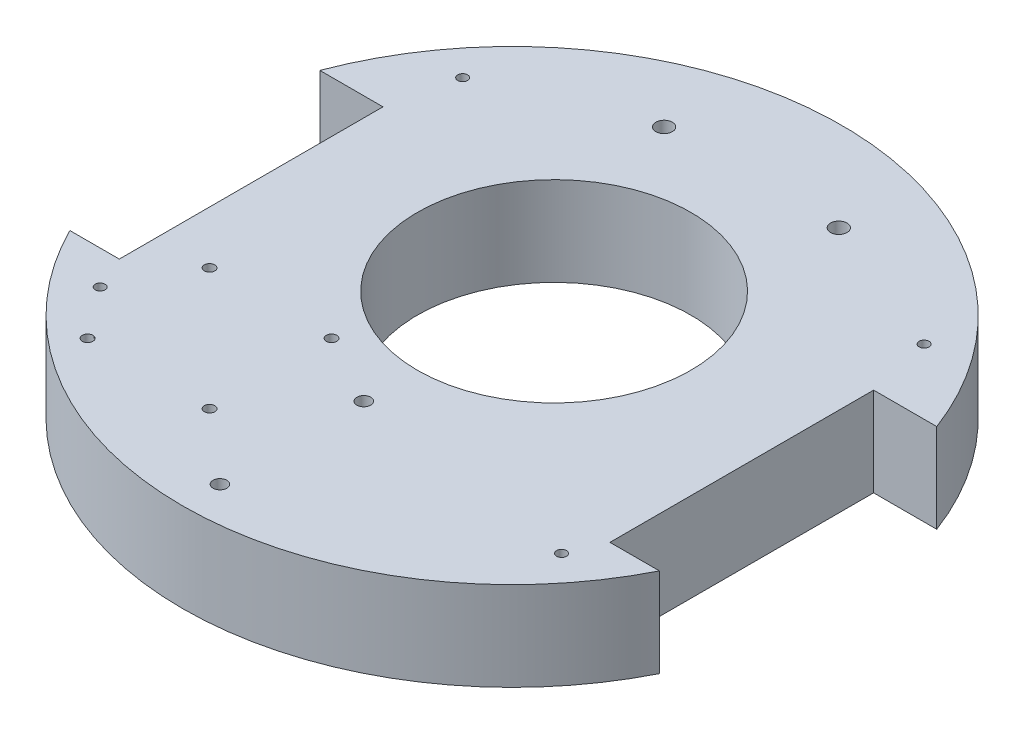
ISO-10303-21;
HEADER;
FILE_DESCRIPTION(('STEP AP214'),'2;1');
FILE_NAME('part.step','',(''),(''),'','','');
FILE_SCHEMA(('AUTOMOTIVE_DESIGN { 1 0 10303 214 1 1 1 1 }'));
ENDSEC;
DATA;
#1=APPLICATION_CONTEXT('core data for automotive mechanical design processes');
#2=APPLICATION_PROTOCOL_DEFINITION('international standard','automotive_design',2000,#1);
#3=PRODUCT_CONTEXT('',#1,'mechanical');
#4=PRODUCT('Part','Part','',(#3));
#5=PRODUCT_RELATED_PRODUCT_CATEGORY('part','',(#4));
#6=PRODUCT_DEFINITION_FORMATION('','',#4);
#7=PRODUCT_DEFINITION_CONTEXT('part definition',#1,'design');
#8=PRODUCT_DEFINITION('design','',#6,#7);
#9=PRODUCT_DEFINITION_SHAPE('','',#8);
#10=(LENGTH_UNIT() NAMED_UNIT(*) SI_UNIT(.MILLI.,.METRE.));
#11=(NAMED_UNIT(*) PLANE_ANGLE_UNIT() SI_UNIT($,.RADIAN.));
#12=(NAMED_UNIT(*) SI_UNIT($,.STERADIAN.) SOLID_ANGLE_UNIT());
#13=UNCERTAINTY_MEASURE_WITH_UNIT(LENGTH_MEASURE(1.E-05),#10,'distance_accuracy_value','');
#14=(GEOMETRIC_REPRESENTATION_CONTEXT(3) GLOBAL_UNCERTAINTY_ASSIGNED_CONTEXT((#13)) GLOBAL_UNIT_ASSIGNED_CONTEXT((#10,
#11,#12)) REPRESENTATION_CONTEXT('',''));
#15=CARTESIAN_POINT('',(0.,0.,0.));
#16=DIRECTION('',(0.,0.,1.));
#17=DIRECTION('',(1.,0.,0.));
#18=AXIS2_PLACEMENT_3D('',#15,#16,#17);
#19=CARTESIAN_POINT('',(0.,27.,0.));
#20=DIRECTION('',(0.,1.,0.));
#21=DIRECTION('',(0.,0.,1.));
#22=AXIS2_PLACEMENT_3D('',#19,#20,#21);
#23=PLANE('',#22);
#24=CARTESIAN_POINT('',(-26.5,27.,-72.6149178899232));
#25=DIRECTION('',(0.,1.,0.));
#26=DIRECTION('',(0.,0.,1.));
#27=AXIS2_PLACEMENT_3D('',#24,#25,#26);
#28=CIRCLE('',#27,2.5);
#29=CARTESIAN_POINT('',(-26.5,27.,-70.1149178899232));
#30=VERTEX_POINT('',#29);
#31=EDGE_CURVE('E500',#30,#30,#28,.T.);
#32=ORIENTED_EDGE('',*,*,#31,.F.);
#33=EDGE_LOOP('',(#32));
#34=FACE_BOUND('',#33,.T.);
#35=CARTESIAN_POINT('',(26.5,27.,-72.6149178899232));
#36=DIRECTION('',(0.,1.,0.));
#37=DIRECTION('',(0.,0.,1.));
#38=AXIS2_PLACEMENT_3D('',#35,#36,#37);
#39=CIRCLE('',#38,2.5);
#40=CARTESIAN_POINT('',(26.5,27.,-70.1149178899232));
#41=VERTEX_POINT('',#40);
#42=EDGE_CURVE('E518',#41,#41,#39,.T.);
#43=ORIENTED_EDGE('',*,*,#42,.F.);
#44=EDGE_LOOP('',(#43));
#45=FACE_BOUND('',#44,.T.);
#46=CARTESIAN_POINT('',(-70.,27.,55.));
#47=DIRECTION('',(0.,1.,0.));
#48=DIRECTION('',(0.,0.,1.));
#49=AXIS2_PLACEMENT_3D('',#46,#47,#48);
#50=CIRCLE('',#49,1.5);
#51=CARTESIAN_POINT('',(-70.,27.,56.5));
#52=VERTEX_POINT('',#51);
#53=EDGE_CURVE('E168',#52,#52,#50,.T.);
#54=ORIENTED_EDGE('',*,*,#53,.F.);
#55=EDGE_LOOP('',(#54));
#56=FACE_BOUND('',#55,.T.);
#57=CARTESIAN_POINT('',(-21.4181356400561,27.,70.3749468771771));
#58=DIRECTION('',(0.,1.,0.));
#59=DIRECTION('',(0.,0.,1.));
#60=AXIS2_PLACEMENT_3D('',#57,#58,#59);
#61=CIRCLE('',#60,1.60000000000001);
#62=CARTESIAN_POINT('',(-21.4181356400561,27.,71.9749468771771));
#63=VERTEX_POINT('',#62);
#64=EDGE_CURVE('E473',#63,#63,#61,.T.);
#65=ORIENTED_EDGE('',*,*,#64,.F.);
#66=EDGE_LOOP('',(#65));
#67=FACE_BOUND('',#66,.T.);
#68=CARTESIAN_POINT('',(-58.4181356400561,27.,70.3749468771771));
#69=DIRECTION('',(0.,1.,0.));
#70=DIRECTION('',(0.,0.,1.));
#71=AXIS2_PLACEMENT_3D('',#68,#69,#70);
#72=CIRCLE('',#71,1.6);
#73=CARTESIAN_POINT('',(-58.4181356400561,27.,71.9749468771771));
#74=VERTEX_POINT('',#73);
#75=EDGE_CURVE('E471',#74,#74,#72,.T.);
#76=ORIENTED_EDGE('',*,*,#75,.F.);
#77=EDGE_LOOP('',(#76));
#78=FACE_BOUND('',#77,.T.);
#79=CARTESIAN_POINT('',(-21.4181356400561,27.,33.3749468771771));
#80=DIRECTION('',(0.,1.,0.));
#81=DIRECTION('',(0.,0.,1.));
#82=AXIS2_PLACEMENT_3D('',#79,#80,#81);
#83=CIRCLE('',#82,1.6);
#84=CARTESIAN_POINT('',(-21.4181356400561,27.,34.9749468771771));
#85=VERTEX_POINT('',#84);
#86=EDGE_CURVE('E468',#85,#85,#83,.T.);
#87=ORIENTED_EDGE('',*,*,#86,.F.);
#88=EDGE_LOOP('',(#87));
#89=FACE_BOUND('',#88,.T.);
#90=CARTESIAN_POINT('',(70.,27.,55.));
#91=DIRECTION('',(0.,1.,0.));
#92=DIRECTION('',(0.,0.,1.));
#93=AXIS2_PLACEMENT_3D('',#90,#91,#92);
#94=CIRCLE('',#93,1.5);
#95=CARTESIAN_POINT('',(70.,27.,56.5));
#96=VERTEX_POINT('',#95);
#97=EDGE_CURVE('E453',#96,#96,#94,.F.);
#98=ORIENTED_EDGE('',*,*,#97,.T.);
#99=EDGE_LOOP('',(#98));
#100=FACE_BOUND('',#99,.T.);
#101=CARTESIAN_POINT('',(-58.4181356400561,27.,33.3749468771771));
#102=DIRECTION('',(0.,1.,0.));
#103=DIRECTION('',(0.,0.,1.));
#104=AXIS2_PLACEMENT_3D('',#101,#102,#103);
#105=CIRCLE('',#104,1.6);
#106=CARTESIAN_POINT('',(-58.4181356400561,27.,34.9749468771771));
#107=VERTEX_POINT('',#106);
#108=EDGE_CURVE('E446',#107,#107,#105,.T.);
#109=ORIENTED_EDGE('',*,*,#108,.F.);
#110=EDGE_LOOP('',(#109));
#111=FACE_BOUND('',#110,.T.);
#112=CARTESIAN_POINT('',(0.,27.,45.));
#113=DIRECTION('',(0.,1.,0.));
#114=DIRECTION('',(0.,0.,1.));
#115=AXIS2_PLACEMENT_3D('',#112,#113,#114);
#116=CIRCLE('',#115,2.10000000000001);
#117=CARTESIAN_POINT('',(0.,27.,47.1));
#118=VERTEX_POINT('',#117);
#119=EDGE_CURVE('E157',#118,#118,#116,.T.);
#120=ORIENTED_EDGE('',*,*,#119,.F.);
#121=EDGE_LOOP('',(#120));
#122=FACE_BOUND('',#121,.T.);
#123=CARTESIAN_POINT('',(0.,27.,88.65));
#124=DIRECTION('',(0.,1.,0.));
#125=DIRECTION('',(0.,0.,1.));
#126=AXIS2_PLACEMENT_3D('',#123,#124,#125);
#127=CIRCLE('',#126,2.10000000000001);
#128=CARTESIAN_POINT('',(0.,27.,90.75));
#129=VERTEX_POINT('',#128);
#130=EDGE_CURVE('E163',#129,#129,#127,.T.);
#131=ORIENTED_EDGE('',*,*,#130,.F.);
#132=EDGE_LOOP('',(#131));
#133=FACE_BOUND('',#132,.T.);
#134=CARTESIAN_POINT('',(0.,27.,-12.7435458826146));
#135=DIRECTION('',(0.,1.,0.));
#136=DIRECTION('',(0.,0.,1.));
#137=AXIS2_PLACEMENT_3D('',#134,#135,#136);
#138=CIRCLE('',#137,41.5);
#139=CARTESIAN_POINT('',(0.,27.,28.7564541173854));
#140=VERTEX_POINT('',#139);
#141=EDGE_CURVE('E116',#140,#140,#138,.T.);
#142=ORIENTED_EDGE('',*,*,#141,.F.);
#143=EDGE_LOOP('',(#142));
#144=FACE_BOUND('',#143,.T.);
#145=DIRECTION('',(1.,0.,0.));
#146=VECTOR('',#145,1.);
#147=CARTESIAN_POINT('',(0.,27.,44.7499999999999));
#148=LINE('',#147,#146);
#149=CARTESIAN_POINT('',(74.428393142223,27.,44.75));
#150=VERTEX_POINT('',#149);
#151=CARTESIAN_POINT('',(89.428393142223,27.,44.75));
#152=VERTEX_POINT('',#151);
#153=EDGE_CURVE('E105',#150,#152,#148,.T.);
#154=ORIENTED_EDGE('',*,*,#153,.F.);
#155=DIRECTION('',(0.,0.,1.));
#156=VECTOR('',#155,1.);
#157=CARTESIAN_POINT('',(74.428393142223,27.,0.));
#158=LINE('',#157,#156);
#159=CARTESIAN_POINT('',(74.428393142223,27.,-35.25));
#160=VERTEX_POINT('',#159);
#161=EDGE_CURVE('E127',#160,#150,#158,.T.);
#162=ORIENTED_EDGE('',*,*,#161,.F.);
#163=DIRECTION('',(1.,0.,0.));
#164=VECTOR('',#163,1.);
#165=CARTESIAN_POINT('',(0.,27.,-35.25));
#166=LINE('',#165,#164);
#167=CARTESIAN_POINT('',(93.5811813347106,27.,-35.25));
#168=VERTEX_POINT('',#167);
#169=EDGE_CURVE('E115',#160,#168,#166,.T.);
#170=ORIENTED_EDGE('',*,*,#169,.T.);
#171=CARTESIAN_POINT('',(0.,27.,0.));
#172=DIRECTION('',(0.,1.,0.));
#173=DIRECTION('',(0.,0.,1.));
#174=AXIS2_PLACEMENT_3D('',#171,#172,#173);
#175=CIRCLE('',#174,100.);
#176=CARTESIAN_POINT('',(-93.5811813347107,27.,-35.25));
#177=VERTEX_POINT('',#176);
#178=EDGE_CURVE('E134',#168,#177,#175,.T.);
#179=ORIENTED_EDGE('',*,*,#178,.T.);
#180=DIRECTION('',(-1.,0.,0.));
#181=VECTOR('',#180,1.);
#182=CARTESIAN_POINT('',(0.,27.,-35.25));
#183=LINE('',#182,#181);
#184=CARTESIAN_POINT('',(-74.428393142223,27.,-35.25));
#185=VERTEX_POINT('',#184);
#186=EDGE_CURVE('E181',#185,#177,#183,.T.);
#187=ORIENTED_EDGE('',*,*,#186,.F.);
#188=DIRECTION('',(0.,0.,1.));
#189=VECTOR('',#188,1.);
#190=CARTESIAN_POINT('',(-74.428393142223,27.,0.));
#191=LINE('',#190,#189);
#192=CARTESIAN_POINT('',(-74.428393142223,27.,44.75));
#193=VERTEX_POINT('',#192);
#194=EDGE_CURVE('E186',#185,#193,#191,.T.);
#195=ORIENTED_EDGE('',*,*,#194,.T.);
#196=DIRECTION('',(-1.,0.,0.));
#197=VECTOR('',#196,1.);
#198=CARTESIAN_POINT('',(0.,27.,44.7499999999999));
#199=LINE('',#198,#197);
#200=CARTESIAN_POINT('',(-89.428393142223,27.,44.75));
#201=VERTEX_POINT('',#200);
#202=EDGE_CURVE('E133',#193,#201,#199,.T.);
#203=ORIENTED_EDGE('',*,*,#202,.T.);
#204=EDGE_CURVE('E123',#201,#152,#175,.T.);
#205=ORIENTED_EDGE('',*,*,#204,.T.);
#206=EDGE_LOOP('',(#154,#162,#170,#179,#187,#195,#203,#205));
#207=FACE_BOUND('',#206,.T.);
#208=CARTESIAN_POINT('',(70.,27.,-55.));
#209=DIRECTION('',(0.,1.,0.));
#210=DIRECTION('',(0.,0.,1.));
#211=AXIS2_PLACEMENT_3D('',#208,#209,#210);
#212=CIRCLE('',#211,1.5);
#213=CARTESIAN_POINT('',(70.,27.,-53.5));
#214=VERTEX_POINT('',#213);
#215=EDGE_CURVE('E462',#214,#214,#212,.T.);
#216=ORIENTED_EDGE('',*,*,#215,.F.);
#217=EDGE_LOOP('',(#216));
#218=FACE_BOUND('',#217,.T.);
#219=CARTESIAN_POINT('',(-70.,27.,-55.));
#220=DIRECTION('',(0.,1.,0.));
#221=DIRECTION('',(0.,0.,1.));
#222=AXIS2_PLACEMENT_3D('',#219,#220,#221);
#223=CIRCLE('',#222,1.5);
#224=CARTESIAN_POINT('',(-70.,27.,-53.5));
#225=VERTEX_POINT('',#224);
#226=EDGE_CURVE('E465',#225,#225,#223,.F.);
#227=ORIENTED_EDGE('',*,*,#226,.T.);
#228=EDGE_LOOP('',(#227));
#229=FACE_BOUND('',#228,.T.);
#230=ADVANCED_FACE('F39',(#34,#45,#56,#67,#78,#89,#100,#111,#122,#133,#144,#207,#218,#229),#23,.T.);
#231=CARTESIAN_POINT('',(0.,0.,0.));
#232=DIRECTION('',(0.,1.,0.));
#233=DIRECTION('',(0.,0.,1.));
#234=AXIS2_PLACEMENT_3D('',#231,#232,#233);
#235=PLANE('',#234);
#236=CARTESIAN_POINT('',(-26.5,0.,-72.6149178899232));
#237=DIRECTION('',(0.,1.,0.));
#238=DIRECTION('',(0.,0.,1.));
#239=AXIS2_PLACEMENT_3D('',#236,#237,#238);
#240=CIRCLE('',#239,2.5);
#241=CARTESIAN_POINT('',(-26.5,0.,-70.1149178899232));
#242=VERTEX_POINT('',#241);
#243=EDGE_CURVE('E494',#242,#242,#240,.T.);
#244=ORIENTED_EDGE('',*,*,#243,.T.);
#245=EDGE_LOOP('',(#244));
#246=FACE_BOUND('',#245,.T.);
#247=CARTESIAN_POINT('',(26.5,0.,-72.6149178899232));
#248=DIRECTION('',(0.,1.,0.));
#249=DIRECTION('',(0.,0.,1.));
#250=AXIS2_PLACEMENT_3D('',#247,#248,#249);
#251=CIRCLE('',#250,2.5);
#252=CARTESIAN_POINT('',(26.5,0.,-70.1149178899232));
#253=VERTEX_POINT('',#252);
#254=EDGE_CURVE('E515',#253,#253,#251,.T.);
#255=ORIENTED_EDGE('',*,*,#254,.T.);
#256=EDGE_LOOP('',(#255));
#257=FACE_BOUND('',#256,.T.);
#258=CARTESIAN_POINT('',(-70.,0.,55.));
#259=DIRECTION('',(0.,1.,0.));
#260=DIRECTION('',(0.,0.,1.));
#261=AXIS2_PLACEMENT_3D('',#258,#259,#260);
#262=CIRCLE('',#261,1.5);
#263=CARTESIAN_POINT('',(-70.,0.,56.5));
#264=VERTEX_POINT('',#263);
#265=EDGE_CURVE('E507',#264,#264,#262,.T.);
#266=ORIENTED_EDGE('',*,*,#265,.T.);
#267=EDGE_LOOP('',(#266));
#268=FACE_BOUND('',#267,.T.);
#269=CARTESIAN_POINT('',(-21.4181356400561,0.,70.3749468771771));
#270=DIRECTION('',(0.,1.,0.));
#271=DIRECTION('',(0.,0.,1.));
#272=AXIS2_PLACEMENT_3D('',#269,#270,#271);
#273=CIRCLE('',#272,1.60000000000001);
#274=CARTESIAN_POINT('',(-21.4181356400561,0.,71.9749468771771));
#275=VERTEX_POINT('',#274);
#276=EDGE_CURVE('E504',#275,#275,#273,.T.);
#277=ORIENTED_EDGE('',*,*,#276,.T.);
#278=EDGE_LOOP('',(#277));
#279=FACE_BOUND('',#278,.T.);
#280=CARTESIAN_POINT('',(-58.4181356400561,0.,70.3749468771771));
#281=DIRECTION('',(0.,1.,0.));
#282=DIRECTION('',(0.,0.,1.));
#283=AXIS2_PLACEMENT_3D('',#280,#281,#282);
#284=CIRCLE('',#283,1.6);
#285=CARTESIAN_POINT('',(-58.4181356400561,0.,71.9749468771771));
#286=VERTEX_POINT('',#285);
#287=EDGE_CURVE('E456',#286,#286,#284,.T.);
#288=ORIENTED_EDGE('',*,*,#287,.T.);
#289=EDGE_LOOP('',(#288));
#290=FACE_BOUND('',#289,.T.);
#291=CARTESIAN_POINT('',(-21.4181356400561,0.,33.3749468771771));
#292=DIRECTION('',(0.,1.,0.));
#293=DIRECTION('',(0.,0.,1.));
#294=AXIS2_PLACEMENT_3D('',#291,#292,#293);
#295=CIRCLE('',#294,1.6);
#296=CARTESIAN_POINT('',(-21.4181356400561,0.,34.9749468771771));
#297=VERTEX_POINT('',#296);
#298=EDGE_CURVE('E451',#297,#297,#295,.T.);
#299=ORIENTED_EDGE('',*,*,#298,.T.);
#300=EDGE_LOOP('',(#299));
#301=FACE_BOUND('',#300,.T.);
#302=CARTESIAN_POINT('',(70.,0.,-55.));
#303=DIRECTION('',(0.,1.,0.));
#304=DIRECTION('',(0.,0.,1.));
#305=AXIS2_PLACEMENT_3D('',#302,#303,#304);
#306=CIRCLE('',#305,1.5);
#307=CARTESIAN_POINT('',(70.,0.,-53.5));
#308=VERTEX_POINT('',#307);
#309=EDGE_CURVE('E493',#308,#308,#306,.T.);
#310=ORIENTED_EDGE('',*,*,#309,.T.);
#311=EDGE_LOOP('',(#310));
#312=FACE_BOUND('',#311,.T.);
#313=CARTESIAN_POINT('',(-58.4181356400561,0.,33.3749468771771));
#314=DIRECTION('',(0.,1.,0.));
#315=DIRECTION('',(0.,0.,1.));
#316=AXIS2_PLACEMENT_3D('',#313,#314,#315);
#317=CIRCLE('',#316,1.6);
#318=CARTESIAN_POINT('',(-58.4181356400561,0.,34.9749468771771));
#319=VERTEX_POINT('',#318);
#320=EDGE_CURVE('E449',#319,#319,#317,.T.);
#321=ORIENTED_EDGE('',*,*,#320,.T.);
#322=EDGE_LOOP('',(#321));
#323=FACE_BOUND('',#322,.T.);
#324=CARTESIAN_POINT('',(0.,0.,45.));
#325=DIRECTION('',(0.,1.,0.));
#326=DIRECTION('',(0.,0.,1.));
#327=AXIS2_PLACEMENT_3D('',#324,#325,#326);
#328=CIRCLE('',#327,2.10000000000001);
#329=CARTESIAN_POINT('',(0.,0.,47.1));
#330=VERTEX_POINT('',#329);
#331=EDGE_CURVE('E43',#330,#330,#328,.F.);
#332=ORIENTED_EDGE('',*,*,#331,.F.);
#333=EDGE_LOOP('',(#332));
#334=FACE_BOUND('',#333,.T.);
#335=CARTESIAN_POINT('',(0.,0.,88.65));
#336=DIRECTION('',(0.,1.,0.));
#337=DIRECTION('',(0.,0.,1.));
#338=AXIS2_PLACEMENT_3D('',#335,#336,#337);
#339=CIRCLE('',#338,2.10000000000001);
#340=CARTESIAN_POINT('',(0.,0.,90.75));
#341=VERTEX_POINT('',#340);
#342=EDGE_CURVE('E155',#341,#341,#339,.F.);
#343=ORIENTED_EDGE('',*,*,#342,.F.);
#344=EDGE_LOOP('',(#343));
#345=FACE_BOUND('',#344,.T.);
#346=CARTESIAN_POINT('',(0.,0.,-12.7435458826146));
#347=DIRECTION('',(0.,1.,0.));
#348=DIRECTION('',(0.,0.,1.));
#349=AXIS2_PLACEMENT_3D('',#346,#347,#348);
#350=CIRCLE('',#349,41.5);
#351=CARTESIAN_POINT('',(0.,0.,28.7564541173854));
#352=VERTEX_POINT('',#351);
#353=EDGE_CURVE('E161',#352,#352,#350,.T.);
#354=ORIENTED_EDGE('',*,*,#353,.T.);
#355=EDGE_LOOP('',(#354));
#356=FACE_BOUND('',#355,.T.);
#357=DIRECTION('',(0.,0.,1.));
#358=VECTOR('',#357,1.);
#359=CARTESIAN_POINT('',(74.428393142223,0.,0.));
#360=LINE('',#359,#358);
#361=CARTESIAN_POINT('',(74.428393142223,0.,-35.25));
#362=VERTEX_POINT('',#361);
#363=CARTESIAN_POINT('',(74.428393142223,0.,44.75));
#364=VERTEX_POINT('',#363);
#365=EDGE_CURVE('E48',#362,#364,#360,.T.);
#366=ORIENTED_EDGE('',*,*,#365,.T.);
#367=DIRECTION('',(1.,0.,0.));
#368=VECTOR('',#367,1.);
#369=CARTESIAN_POINT('',(0.,0.,44.7499999999999));
#370=LINE('',#369,#368);
#371=CARTESIAN_POINT('',(89.428393142223,0.,44.75));
#372=VERTEX_POINT('',#371);
#373=EDGE_CURVE('E11',#364,#372,#370,.T.);
#374=ORIENTED_EDGE('',*,*,#373,.T.);
#375=CARTESIAN_POINT('',(0.,0.,0.));
#376=DIRECTION('',(0.,1.,0.));
#377=DIRECTION('',(0.,0.,1.));
#378=AXIS2_PLACEMENT_3D('',#375,#376,#377);
#379=CIRCLE('',#378,100.);
#380=CARTESIAN_POINT('',(-89.428393142223,0.,44.75));
#381=VERTEX_POINT('',#380);
#382=EDGE_CURVE('E125',#381,#372,#379,.T.);
#383=ORIENTED_EDGE('',*,*,#382,.F.);
#384=DIRECTION('',(1.,0.,0.));
#385=VECTOR('',#384,1.);
#386=CARTESIAN_POINT('',(0.,0.,44.7499999999999));
#387=LINE('',#386,#385);
#388=CARTESIAN_POINT('',(-74.428393142223,0.,44.75));
#389=VERTEX_POINT('',#388);
#390=EDGE_CURVE('E147',#381,#389,#387,.T.);
#391=ORIENTED_EDGE('',*,*,#390,.T.);
#392=DIRECTION('',(0.,0.,-1.));
#393=VECTOR('',#392,1.);
#394=CARTESIAN_POINT('',(-74.428393142223,0.,0.));
#395=LINE('',#394,#393);
#396=CARTESIAN_POINT('',(-74.428393142223,0.,-35.25));
#397=VERTEX_POINT('',#396);
#398=EDGE_CURVE('E138',#389,#397,#395,.T.);
#399=ORIENTED_EDGE('',*,*,#398,.T.);
#400=DIRECTION('',(1.,0.,0.));
#401=VECTOR('',#400,1.);
#402=CARTESIAN_POINT('',(0.,0.,-35.25));
#403=LINE('',#402,#401);
#404=CARTESIAN_POINT('',(-93.5811813347107,0.,-35.25));
#405=VERTEX_POINT('',#404);
#406=EDGE_CURVE('E150',#405,#397,#403,.T.);
#407=ORIENTED_EDGE('',*,*,#406,.F.);
#408=CARTESIAN_POINT('',(93.5811813347106,0.,-35.25));
#409=VERTEX_POINT('',#408);
#410=EDGE_CURVE('E135',#409,#405,#379,.T.);
#411=ORIENTED_EDGE('',*,*,#410,.F.);
#412=DIRECTION('',(1.,0.,0.));
#413=VECTOR('',#412,1.);
#414=CARTESIAN_POINT('',(0.,0.,-35.25));
#415=LINE('',#414,#413);
#416=EDGE_CURVE('E152',#362,#409,#415,.T.);
#417=ORIENTED_EDGE('',*,*,#416,.F.);
#418=EDGE_LOOP('',(#366,#374,#383,#391,#399,#407,#411,#417));
#419=FACE_BOUND('',#418,.T.);
#420=CARTESIAN_POINT('',(70.,0.,55.));
#421=DIRECTION('',(0.,-1.,0.));
#422=DIRECTION('',(0.,0.,-1.));
#423=AXIS2_PLACEMENT_3D('',#420,#421,#422);
#424=CIRCLE('',#423,1.5);
#425=CARTESIAN_POINT('',(70.,0.,53.5));
#426=VERTEX_POINT('',#425);
#427=EDGE_CURVE('E492',#426,#426,#424,.T.);
#428=ORIENTED_EDGE('',*,*,#427,.F.);
#429=EDGE_LOOP('',(#428));
#430=FACE_BOUND('',#429,.T.);
#431=CARTESIAN_POINT('',(-70.,0.,-55.));
#432=DIRECTION('',(0.,-1.,0.));
#433=DIRECTION('',(0.,0.,-1.));
#434=AXIS2_PLACEMENT_3D('',#431,#432,#433);
#435=CIRCLE('',#434,1.5);
#436=CARTESIAN_POINT('',(-70.,0.,-56.5));
#437=VERTEX_POINT('',#436);
#438=EDGE_CURVE('E497',#437,#437,#435,.T.);
#439=ORIENTED_EDGE('',*,*,#438,.F.);
#440=EDGE_LOOP('',(#439));
#441=FACE_BOUND('',#440,.T.);
#442=ADVANCED_FACE('F201',(#246,#257,#268,#279,#290,#301,#312,#323,#334,#345,#356,#419,#430,
#441),#235,.F.);
#443=CARTESIAN_POINT('',(0.,27.,0.));
#444=DIRECTION('',(0.,-1.,0.));
#445=DIRECTION('',(0.,0.,-1.));
#446=AXIS2_PLACEMENT_3D('',#443,#444,#445);
#447=CYLINDRICAL_SURFACE('',#446,100.);
#448=DIRECTION('',(0.,1.,0.));
#449=VECTOR('',#448,1.);
#450=CARTESIAN_POINT('',(93.5811813347106,-10.,-35.25));
#451=LINE('',#450,#449);
#452=EDGE_CURVE('E126',#409,#168,#451,.T.);
#453=ORIENTED_EDGE('',*,*,#452,.F.);
#454=ORIENTED_EDGE('',*,*,#410,.T.);
#455=DIRECTION('',(0.,-1.,0.));
#456=VECTOR('',#455,1.);
#457=CARTESIAN_POINT('',(-93.5811813347107,27.,-35.25));
#458=LINE('',#457,#456);
#459=EDGE_CURVE('E142',#177,#405,#458,.T.);
#460=ORIENTED_EDGE('',*,*,#459,.F.);
#461=ORIENTED_EDGE('',*,*,#178,.F.);
#462=EDGE_LOOP('',(#453,#454,#460,#461));
#463=FACE_BOUND('',#462,.T.);
#464=ADVANCED_FACE('F41',(#463),#447,.T.);
#465=ORIENTED_EDGE('',*,*,#382,.T.);
#466=DIRECTION('',(0.,1.,0.));
#467=VECTOR('',#466,1.);
#468=CARTESIAN_POINT('',(89.428393142223,-10.,44.75));
#469=LINE('',#468,#467);
#470=EDGE_CURVE('E108',#372,#152,#469,.T.);
#471=ORIENTED_EDGE('',*,*,#470,.T.);
#472=ORIENTED_EDGE('',*,*,#204,.F.);
#473=DIRECTION('',(0.,-1.,0.));
#474=VECTOR('',#473,1.);
#475=CARTESIAN_POINT('',(-89.428393142223,27.,44.75));
#476=LINE('',#475,#474);
#477=EDGE_CURVE('E191',#201,#381,#476,.T.);
#478=ORIENTED_EDGE('',*,*,#477,.T.);
#479=EDGE_LOOP('',(#465,#471,#472,#478));
#480=FACE_BOUND('',#479,.T.);
#481=ADVANCED_FACE('F121',(#480),#447,.T.);
#482=CARTESIAN_POINT('',(0.,27.,-35.25));
#483=DIRECTION('',(0.,0.,1.));
#484=DIRECTION('',(1.,0.,0.));
#485=AXIS2_PLACEMENT_3D('',#482,#483,#484);
#486=PLANE('',#485);
#487=ORIENTED_EDGE('',*,*,#406,.T.);
#488=DIRECTION('',(0.,-1.,0.));
#489=VECTOR('',#488,1.);
#490=CARTESIAN_POINT('',(-74.428393142223,27.,-35.25));
#491=LINE('',#490,#489);
#492=EDGE_CURVE('E64',#185,#397,#491,.T.);
#493=ORIENTED_EDGE('',*,*,#492,.F.);
#494=ORIENTED_EDGE('',*,*,#186,.T.);
#495=ORIENTED_EDGE('',*,*,#459,.T.);
#496=EDGE_LOOP('',(#487,#493,#494,#495));
#497=FACE_BOUND('',#496,.T.);
#498=ADVANCED_FACE('F195',(#497),#486,.T.);
#499=CARTESIAN_POINT('',(0.,27.,44.7499999999999));
#500=DIRECTION('',(0.,0.,1.));
#501=DIRECTION('',(1.,0.,0.));
#502=AXIS2_PLACEMENT_3D('',#499,#500,#501);
#503=PLANE('',#502);
#504=ORIENTED_EDGE('',*,*,#477,.F.);
#505=ORIENTED_EDGE('',*,*,#202,.F.);
#506=DIRECTION('',(0.,-1.,0.));
#507=VECTOR('',#506,1.);
#508=CARTESIAN_POINT('',(-74.428393142223,27.,44.75));
#509=LINE('',#508,#507);
#510=EDGE_CURVE('E189',#193,#389,#509,.T.);
#511=ORIENTED_EDGE('',*,*,#510,.T.);
#512=ORIENTED_EDGE('',*,*,#390,.F.);
#513=EDGE_LOOP('',(#504,#505,#511,#512));
#514=FACE_BOUND('',#513,.T.);
#515=ADVANCED_FACE('F209',(#514),#503,.F.);
#516=CARTESIAN_POINT('',(-74.428393142223,27.,0.));
#517=DIRECTION('',(1.,0.,0.));
#518=DIRECTION('',(0.,0.,-1.));
#519=AXIS2_PLACEMENT_3D('',#516,#517,#518);
#520=PLANE('',#519);
#521=ORIENTED_EDGE('',*,*,#510,.F.);
#522=ORIENTED_EDGE('',*,*,#194,.F.);
#523=ORIENTED_EDGE('',*,*,#492,.T.);
#524=ORIENTED_EDGE('',*,*,#398,.F.);
#525=EDGE_LOOP('',(#521,#522,#523,#524));
#526=FACE_BOUND('',#525,.T.);
#527=ADVANCED_FACE('F210',(#526),#520,.F.);
#528=CARTESIAN_POINT('',(0.,-10.,44.7499999999999));
#529=DIRECTION('',(0.,0.,1.));
#530=DIRECTION('',(1.,0.,0.));
#531=AXIS2_PLACEMENT_3D('',#528,#529,#530);
#532=PLANE('',#531);
#533=DIRECTION('',(0.,1.,0.));
#534=VECTOR('',#533,1.);
#535=CARTESIAN_POINT('',(74.428393142223,-10.,44.75));
#536=LINE('',#535,#534);
#537=EDGE_CURVE('E110',#364,#150,#536,.T.);
#538=ORIENTED_EDGE('',*,*,#537,.T.);
#539=ORIENTED_EDGE('',*,*,#153,.T.);
#540=ORIENTED_EDGE('',*,*,#470,.F.);
#541=ORIENTED_EDGE('',*,*,#373,.F.);
#542=EDGE_LOOP('',(#538,#539,#540,#541));
#543=FACE_BOUND('',#542,.T.);
#544=ADVANCED_FACE('F107',(#543),#532,.F.);
#545=CARTESIAN_POINT('',(74.428393142223,-10.,0.));
#546=DIRECTION('',(-1.,0.,0.));
#547=DIRECTION('',(0.,0.,1.));
#548=AXIS2_PLACEMENT_3D('',#545,#546,#547);
#549=PLANE('',#548);
#550=DIRECTION('',(0.,1.,0.));
#551=VECTOR('',#550,1.);
#552=CARTESIAN_POINT('',(74.428393142223,-10.,-35.25));
#553=LINE('',#552,#551);
#554=EDGE_CURVE('E56',#362,#160,#553,.T.);
#555=ORIENTED_EDGE('',*,*,#554,.T.);
#556=ORIENTED_EDGE('',*,*,#161,.T.);
#557=ORIENTED_EDGE('',*,*,#537,.F.);
#558=ORIENTED_EDGE('',*,*,#365,.F.);
#559=EDGE_LOOP('',(#555,#556,#557,#558));
#560=FACE_BOUND('',#559,.T.);
#561=ADVANCED_FACE('F207',(#560),#549,.F.);
#562=CARTESIAN_POINT('',(0.,-10.,-35.25));
#563=DIRECTION('',(0.,0.,1.));
#564=DIRECTION('',(1.,0.,0.));
#565=AXIS2_PLACEMENT_3D('',#562,#563,#564);
#566=PLANE('',#565);
#567=ORIENTED_EDGE('',*,*,#416,.T.);
#568=ORIENTED_EDGE('',*,*,#452,.T.);
#569=ORIENTED_EDGE('',*,*,#169,.F.);
#570=ORIENTED_EDGE('',*,*,#554,.F.);
#571=EDGE_LOOP('',(#567,#568,#569,#570));
#572=FACE_BOUND('',#571,.T.);
#573=ADVANCED_FACE('F205',(#572),#566,.T.);
#574=CARTESIAN_POINT('',(0.,27.,-12.7435458826146));
#575=DIRECTION('',(0.,-1.,0.));
#576=DIRECTION('',(0.,0.,-1.));
#577=AXIS2_PLACEMENT_3D('',#574,#575,#576);
#578=CYLINDRICAL_SURFACE('',#577,41.5);
#579=ORIENTED_EDGE('',*,*,#141,.T.);
#580=EDGE_LOOP('',(#579));
#581=FACE_BOUND('',#580,.T.);
#582=ORIENTED_EDGE('',*,*,#353,.F.);
#583=EDGE_LOOP('',(#582));
#584=FACE_BOUND('',#583,.T.);
#585=ADVANCED_FACE('F312',(#581,#584),#578,.F.);
#586=CARTESIAN_POINT('',(0.,27.,88.65));
#587=DIRECTION('',(0.,-1.,0.));
#588=DIRECTION('',(0.,0.,-1.));
#589=AXIS2_PLACEMENT_3D('',#586,#587,#588);
#590=CYLINDRICAL_SURFACE('',#589,2.10000000000001);
#591=ORIENTED_EDGE('',*,*,#130,.T.);
#592=EDGE_LOOP('',(#591));
#593=FACE_BOUND('',#592,.T.);
#594=ORIENTED_EDGE('',*,*,#342,.T.);
#595=EDGE_LOOP('',(#594));
#596=FACE_BOUND('',#595,.T.);
#597=ADVANCED_FACE('F309',(#593,#596),#590,.F.);
#598=CARTESIAN_POINT('',(0.,27.,45.));
#599=DIRECTION('',(0.,-1.,0.));
#600=DIRECTION('',(0.,0.,-1.));
#601=AXIS2_PLACEMENT_3D('',#598,#599,#600);
#602=CYLINDRICAL_SURFACE('',#601,2.10000000000001);
#603=ORIENTED_EDGE('',*,*,#119,.T.);
#604=EDGE_LOOP('',(#603));
#605=FACE_BOUND('',#604,.T.);
#606=ORIENTED_EDGE('',*,*,#331,.T.);
#607=EDGE_LOOP('',(#606));
#608=FACE_BOUND('',#607,.T.);
#609=ADVANCED_FACE('F305',(#605,#608),#602,.F.);
#610=CARTESIAN_POINT('',(-58.4181356400561,0.,33.3749468771771));
#611=DIRECTION('',(0.,1.,0.));
#612=DIRECTION('',(0.,0.,1.));
#613=AXIS2_PLACEMENT_3D('',#610,#611,#612);
#614=CYLINDRICAL_SURFACE('',#613,1.6);
#615=ORIENTED_EDGE('',*,*,#108,.T.);
#616=EDGE_LOOP('',(#615));
#617=FACE_BOUND('',#616,.T.);
#618=ORIENTED_EDGE('',*,*,#320,.F.);
#619=EDGE_LOOP('',(#618));
#620=FACE_BOUND('',#619,.T.);
#621=ADVANCED_FACE('F288',(#617,#620),#614,.F.);
#622=CARTESIAN_POINT('',(70.,0.,55.));
#623=DIRECTION('',(0.,1.,0.));
#624=DIRECTION('',(0.,0.,1.));
#625=AXIS2_PLACEMENT_3D('',#622,#623,#624);
#626=CYLINDRICAL_SURFACE('',#625,1.5);
#627=ORIENTED_EDGE('',*,*,#97,.F.);
#628=EDGE_LOOP('',(#627));
#629=FACE_BOUND('',#628,.T.);
#630=ORIENTED_EDGE('',*,*,#427,.T.);
#631=EDGE_LOOP('',(#630));
#632=FACE_BOUND('',#631,.T.);
#633=ADVANCED_FACE('F284',(#629,#632),#626,.F.);
#634=CARTESIAN_POINT('',(70.,0.,-55.));
#635=DIRECTION('',(0.,1.,0.));
#636=DIRECTION('',(0.,0.,1.));
#637=AXIS2_PLACEMENT_3D('',#634,#635,#636);
#638=CYLINDRICAL_SURFACE('',#637,1.5);
#639=ORIENTED_EDGE('',*,*,#215,.T.);
#640=EDGE_LOOP('',(#639));
#641=FACE_BOUND('',#640,.T.);
#642=ORIENTED_EDGE('',*,*,#309,.F.);
#643=EDGE_LOOP('',(#642));
#644=FACE_BOUND('',#643,.T.);
#645=ADVANCED_FACE('F280',(#641,#644),#638,.F.);
#646=CARTESIAN_POINT('',(-70.,0.,-55.));
#647=DIRECTION('',(0.,1.,0.));
#648=DIRECTION('',(0.,0.,1.));
#649=AXIS2_PLACEMENT_3D('',#646,#647,#648);
#650=CYLINDRICAL_SURFACE('',#649,1.5);
#651=ORIENTED_EDGE('',*,*,#226,.F.);
#652=EDGE_LOOP('',(#651));
#653=FACE_BOUND('',#652,.T.);
#654=ORIENTED_EDGE('',*,*,#438,.T.);
#655=EDGE_LOOP('',(#654));
#656=FACE_BOUND('',#655,.T.);
#657=ADVANCED_FACE('F276',(#653,#656),#650,.F.);
#658=CARTESIAN_POINT('',(-21.4181356400561,0.,33.3749468771771));
#659=DIRECTION('',(0.,1.,0.));
#660=DIRECTION('',(0.,0.,1.));
#661=AXIS2_PLACEMENT_3D('',#658,#659,#660);
#662=CYLINDRICAL_SURFACE('',#661,1.6);
#663=ORIENTED_EDGE('',*,*,#86,.T.);
#664=EDGE_LOOP('',(#663));
#665=FACE_BOUND('',#664,.T.);
#666=ORIENTED_EDGE('',*,*,#298,.F.);
#667=EDGE_LOOP('',(#666));
#668=FACE_BOUND('',#667,.T.);
#669=ADVANCED_FACE('F279',(#665,#668),#662,.F.);
#670=CARTESIAN_POINT('',(-58.4181356400561,0.,70.3749468771771));
#671=DIRECTION('',(0.,1.,0.));
#672=DIRECTION('',(0.,0.,1.));
#673=AXIS2_PLACEMENT_3D('',#670,#671,#672);
#674=CYLINDRICAL_SURFACE('',#673,1.6);
#675=ORIENTED_EDGE('',*,*,#75,.T.);
#676=EDGE_LOOP('',(#675));
#677=FACE_BOUND('',#676,.T.);
#678=ORIENTED_EDGE('',*,*,#287,.F.);
#679=EDGE_LOOP('',(#678));
#680=FACE_BOUND('',#679,.T.);
#681=ADVANCED_FACE('F293',(#677,#680),#674,.F.);
#682=CARTESIAN_POINT('',(-21.4181356400561,0.,70.3749468771771));
#683=DIRECTION('',(0.,1.,0.));
#684=DIRECTION('',(0.,0.,1.));
#685=AXIS2_PLACEMENT_3D('',#682,#683,#684);
#686=CYLINDRICAL_SURFACE('',#685,1.60000000000001);
#687=ORIENTED_EDGE('',*,*,#64,.T.);
#688=EDGE_LOOP('',(#687));
#689=FACE_BOUND('',#688,.T.);
#690=ORIENTED_EDGE('',*,*,#276,.F.);
#691=EDGE_LOOP('',(#690));
#692=FACE_BOUND('',#691,.T.);
#693=ADVANCED_FACE('F290',(#689,#692),#686,.F.);
#694=CARTESIAN_POINT('',(-70.,0.,55.));
#695=DIRECTION('',(0.,1.,0.));
#696=DIRECTION('',(0.,0.,1.));
#697=AXIS2_PLACEMENT_3D('',#694,#695,#696);
#698=CYLINDRICAL_SURFACE('',#697,1.5);
#699=ORIENTED_EDGE('',*,*,#53,.T.);
#700=EDGE_LOOP('',(#699));
#701=FACE_BOUND('',#700,.T.);
#702=ORIENTED_EDGE('',*,*,#265,.F.);
#703=EDGE_LOOP('',(#702));
#704=FACE_BOUND('',#703,.T.);
#705=ADVANCED_FACE('F257',(#701,#704),#698,.F.);
#706=CARTESIAN_POINT('',(26.5,0.,-72.6149178899232));
#707=DIRECTION('',(0.,1.,0.));
#708=DIRECTION('',(0.,0.,1.));
#709=AXIS2_PLACEMENT_3D('',#706,#707,#708);
#710=CYLINDRICAL_SURFACE('',#709,2.5);
#711=ORIENTED_EDGE('',*,*,#254,.F.);
#712=EDGE_LOOP('',(#711));
#713=FACE_BOUND('',#712,.T.);
#714=ORIENTED_EDGE('',*,*,#42,.T.);
#715=EDGE_LOOP('',(#714));
#716=FACE_BOUND('',#715,.T.);
#717=ADVANCED_FACE('F251',(#713,#716),#710,.F.);
#718=CARTESIAN_POINT('',(-26.5,0.,-72.6149178899232));
#719=DIRECTION('',(0.,1.,0.));
#720=DIRECTION('',(0.,0.,1.));
#721=AXIS2_PLACEMENT_3D('',#718,#719,#720);
#722=CYLINDRICAL_SURFACE('',#721,2.5);
#723=ORIENTED_EDGE('',*,*,#243,.F.);
#724=EDGE_LOOP('',(#723));
#725=FACE_BOUND('',#724,.T.);
#726=ORIENTED_EDGE('',*,*,#31,.T.);
#727=EDGE_LOOP('',(#726));
#728=FACE_BOUND('',#727,.T.);
#729=ADVANCED_FACE('F256',(#725,#728),#722,.F.);
#730=CLOSED_SHELL('',(#230,#442,#464,#481,#498,#515,#527,#544,#561,#573,#585,#597,#609,#621,
#633,#645,#657,#669,#681,#693,#705,#717,#729));
#731=MANIFOLD_SOLID_BREP('B2',#730);
#732=ADVANCED_BREP_SHAPE_REPRESENTATION('',(#18,#731),#14);
#733=SHAPE_DEFINITION_REPRESENTATION(#9,#732);
ENDSEC;
END-ISO-10303-21;
